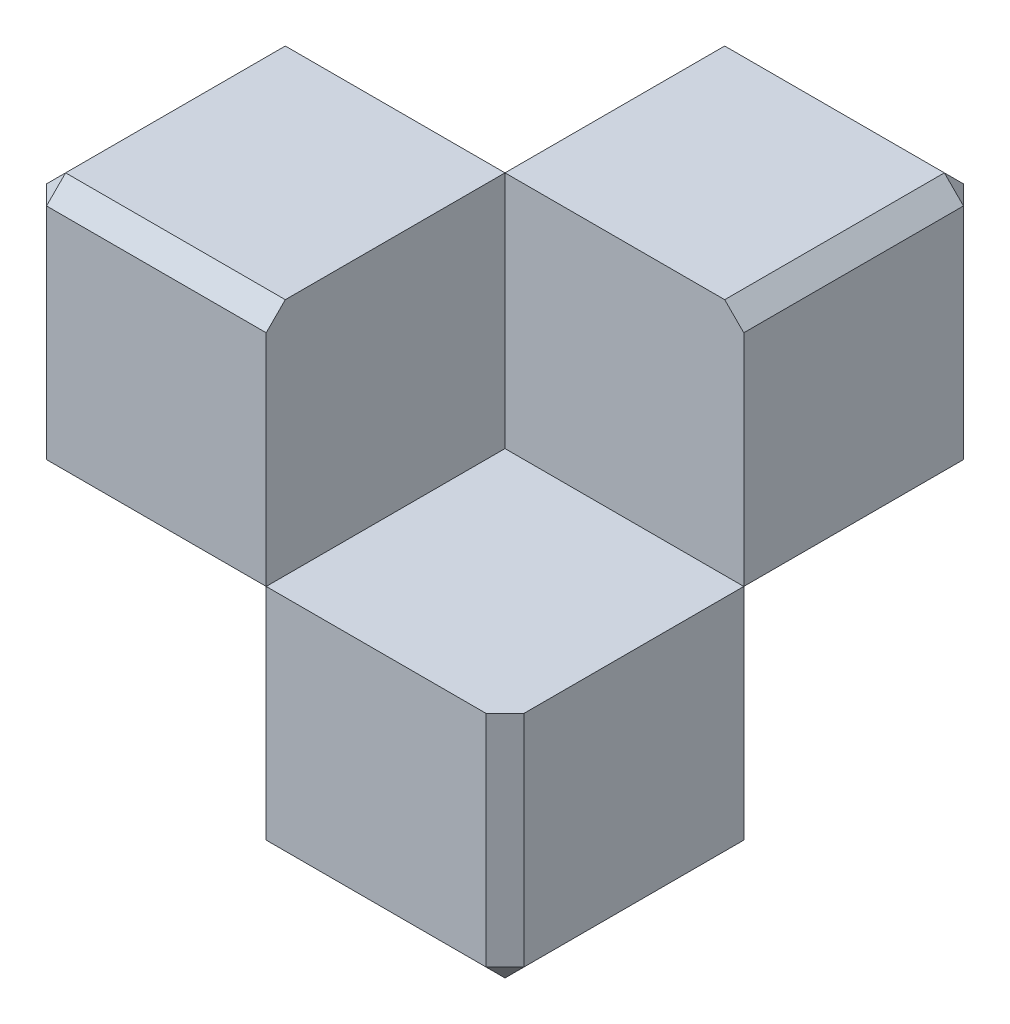
ISO-10303-21;
HEADER;
FILE_DESCRIPTION(('STEP AP214'),'2;1');
FILE_NAME('part.step','',(''),(''),'','','');
FILE_SCHEMA(('AUTOMOTIVE_DESIGN { 1 0 10303 214 1 1 1 1 }'));
ENDSEC;
DATA;
#1=APPLICATION_CONTEXT('core data for automotive mechanical design processes');
#2=APPLICATION_PROTOCOL_DEFINITION('international standard','automotive_design',2000,#1);
#3=PRODUCT_CONTEXT('',#1,'mechanical');
#4=PRODUCT('Part','Part','',(#3));
#5=PRODUCT_RELATED_PRODUCT_CATEGORY('part','',(#4));
#6=PRODUCT_DEFINITION_FORMATION('','',#4);
#7=PRODUCT_DEFINITION_CONTEXT('part definition',#1,'design');
#8=PRODUCT_DEFINITION('design','',#6,#7);
#9=PRODUCT_DEFINITION_SHAPE('','',#8);
#10=(LENGTH_UNIT() NAMED_UNIT(*) SI_UNIT(.MILLI.,.METRE.));
#11=(NAMED_UNIT(*) PLANE_ANGLE_UNIT() SI_UNIT($,.RADIAN.));
#12=(NAMED_UNIT(*) SI_UNIT($,.STERADIAN.) SOLID_ANGLE_UNIT());
#13=UNCERTAINTY_MEASURE_WITH_UNIT(LENGTH_MEASURE(1.E-05),#10,'distance_accuracy_value','');
#14=(GEOMETRIC_REPRESENTATION_CONTEXT(3) GLOBAL_UNCERTAINTY_ASSIGNED_CONTEXT((#13)) GLOBAL_UNIT_ASSIGNED_CONTEXT((#10,
#11,#12)) REPRESENTATION_CONTEXT('',''));
#15=CARTESIAN_POINT('',(0.,0.,0.));
#16=DIRECTION('',(0.,0.,1.));
#17=DIRECTION('',(1.,0.,0.));
#18=AXIS2_PLACEMENT_3D('',#15,#16,#17);
#19=CARTESIAN_POINT('',(25.,0.,50.));
#20=DIRECTION('',(1.,0.,0.));
#21=DIRECTION('',(0.,0.,-1.));
#22=AXIS2_PLACEMENT_3D('',#19,#20,#21);
#23=PLANE('',#22);
#24=DIRECTION('',(0.,0.,-1.));
#25=VECTOR('',#24,1.);
#26=CARTESIAN_POINT('',(25.,0.,50.));
#27=LINE('',#26,#25);
#28=CARTESIAN_POINT('',(25.,0.,48.));
#29=VERTEX_POINT('',#28);
#30=CARTESIAN_POINT('',(25.,0.,25.));
#31=VERTEX_POINT('',#30);
#32=EDGE_CURVE('E121',#29,#31,#27,.T.);
#33=ORIENTED_EDGE('',*,*,#32,.F.);
#34=DIRECTION('',(0.,-1.,0.));
#35=VECTOR('',#34,1.);
#36=CARTESIAN_POINT('',(25.,0.,48.));
#37=LINE('',#36,#35);
#38=CARTESIAN_POINT('',(25.,-23.,48.));
#39=VERTEX_POINT('',#38);
#40=EDGE_CURVE('E140',#29,#39,#37,.T.);
#41=ORIENTED_EDGE('',*,*,#40,.T.);
#42=DIRECTION('',(0.,0.,-1.));
#43=VECTOR('',#42,1.);
#44=CARTESIAN_POINT('',(25.,-23.,25.));
#45=LINE('',#44,#43);
#46=CARTESIAN_POINT('',(25.,-23.,25.));
#47=VERTEX_POINT('',#46);
#48=EDGE_CURVE('E138',#39,#47,#45,.T.);
#49=ORIENTED_EDGE('',*,*,#48,.T.);
#50=DIRECTION('',(0.,-1.,0.));
#51=VECTOR('',#50,1.);
#52=CARTESIAN_POINT('',(25.,0.,25.));
#53=LINE('',#52,#51);
#54=EDGE_CURVE('E131',#31,#47,#53,.T.);
#55=ORIENTED_EDGE('',*,*,#54,.F.);
#56=EDGE_LOOP('',(#33,#41,#49,#55));
#57=FACE_BOUND('',#56,.T.);
#58=ADVANCED_FACE('F46',(#57),#23,.T.);
#59=CARTESIAN_POINT('',(0.,0.,50.));
#60=DIRECTION('',(0.,1.,0.));
#61=DIRECTION('',(0.,0.,1.));
#62=AXIS2_PLACEMENT_3D('',#59,#60,#61);
#63=PLANE('',#62);
#64=DIRECTION('',(1.,0.,0.));
#65=VECTOR('',#64,1.);
#66=CARTESIAN_POINT('',(0.,0.,50.));
#67=LINE('',#66,#65);
#68=CARTESIAN_POINT('',(0.,0.,50.));
#69=VERTEX_POINT('',#68);
#70=CARTESIAN_POINT('',(23.,0.,50.));
#71=VERTEX_POINT('',#70);
#72=EDGE_CURVE('E112',#69,#71,#67,.T.);
#73=ORIENTED_EDGE('',*,*,#72,.T.);
#74=DIRECTION('',(-0.707106781186548,0.,0.707106781186547));
#75=VECTOR('',#74,1.);
#76=CARTESIAN_POINT('',(11.5,0.,61.5));
#77=LINE('',#76,#75);
#78=EDGE_CURVE('E146',#71,#29,#77,.F.);
#79=ORIENTED_EDGE('',*,*,#78,.T.);
#80=ORIENTED_EDGE('',*,*,#32,.T.);
#81=DIRECTION('',(1.,0.,0.));
#82=VECTOR('',#81,1.);
#83=CARTESIAN_POINT('',(0.,0.,25.));
#84=LINE('',#83,#82);
#85=CARTESIAN_POINT('',(0.,0.,25.));
#86=VERTEX_POINT('',#85);
#87=EDGE_CURVE('E119',#86,#31,#84,.T.);
#88=ORIENTED_EDGE('',*,*,#87,.F.);
#89=DIRECTION('',(0.,0.,-1.));
#90=VECTOR('',#89,1.);
#91=CARTESIAN_POINT('',(0.,0.,50.));
#92=LINE('',#91,#90);
#93=EDGE_CURVE('E105',#69,#86,#92,.T.);
#94=ORIENTED_EDGE('',*,*,#93,.F.);
#95=EDGE_LOOP('',(#73,#79,#80,#88,#94));
#96=FACE_BOUND('',#95,.T.);
#97=ADVANCED_FACE('F116',(#96),#63,.T.);
#98=CARTESIAN_POINT('',(0.,0.,50.));
#99=DIRECTION('',(-1.,0.,0.));
#100=DIRECTION('',(0.,-1.,0.));
#101=AXIS2_PLACEMENT_3D('',#98,#99,#100);
#102=PLANE('',#101);
#103=DIRECTION('',(0.,0.,-1.));
#104=VECTOR('',#103,1.);
#105=CARTESIAN_POINT('',(0.,-25.,50.));
#106=LINE('',#105,#104);
#107=CARTESIAN_POINT('',(0.,-25.,48.));
#108=VERTEX_POINT('',#107);
#109=CARTESIAN_POINT('',(0.,-25.,25.));
#110=VERTEX_POINT('',#109);
#111=EDGE_CURVE('E111',#108,#110,#106,.T.);
#112=ORIENTED_EDGE('',*,*,#111,.F.);
#113=DIRECTION('',(0.,0.707106781186546,0.707106781186549));
#114=VECTOR('',#113,1.);
#115=CARTESIAN_POINT('',(0.,-11.5,61.5));
#116=LINE('',#115,#114);
#117=CARTESIAN_POINT('',(0.,-23.,50.));
#118=VERTEX_POINT('',#117);
#119=EDGE_CURVE('E55',#108,#118,#116,.T.);
#120=ORIENTED_EDGE('',*,*,#119,.T.);
#121=DIRECTION('',(0.,1.,0.));
#122=VECTOR('',#121,1.);
#123=CARTESIAN_POINT('',(0.,0.,50.));
#124=LINE('',#123,#122);
#125=EDGE_CURVE('E101',#118,#69,#124,.T.);
#126=ORIENTED_EDGE('',*,*,#125,.T.);
#127=ORIENTED_EDGE('',*,*,#93,.T.);
#128=DIRECTION('',(0.,1.,0.));
#129=VECTOR('',#128,1.);
#130=CARTESIAN_POINT('',(0.,0.,25.));
#131=LINE('',#130,#129);
#132=EDGE_CURVE('E128',#110,#86,#131,.T.);
#133=ORIENTED_EDGE('',*,*,#132,.F.);
#134=EDGE_LOOP('',(#112,#120,#126,#127,#133));
#135=FACE_BOUND('',#134,.T.);
#136=ADVANCED_FACE('F103',(#135),#102,.T.);
#137=CARTESIAN_POINT('',(0.,-25.,50.));
#138=DIRECTION('',(0.,1.,0.));
#139=DIRECTION('',(0.,0.,1.));
#140=AXIS2_PLACEMENT_3D('',#137,#138,#139);
#141=PLANE('',#140);
#142=DIRECTION('',(0.,0.,1.));
#143=VECTOR('',#142,1.);
#144=CARTESIAN_POINT('',(23.,-25.,50.));
#145=LINE('',#144,#143);
#146=CARTESIAN_POINT('',(23.,-25.,25.));
#147=VERTEX_POINT('',#146);
#148=CARTESIAN_POINT('',(23.,-25.,48.));
#149=VERTEX_POINT('',#148);
#150=EDGE_CURVE('E63',#147,#149,#145,.T.);
#151=ORIENTED_EDGE('',*,*,#150,.T.);
#152=DIRECTION('',(-1.,0.,0.));
#153=VECTOR('',#152,1.);
#154=CARTESIAN_POINT('',(0.,-25.,48.));
#155=LINE('',#154,#153);
#156=EDGE_CURVE('E67',#149,#108,#155,.T.);
#157=ORIENTED_EDGE('',*,*,#156,.T.);
#158=ORIENTED_EDGE('',*,*,#111,.T.);
#159=DIRECTION('',(1.,0.,0.));
#160=VECTOR('',#159,1.);
#161=CARTESIAN_POINT('',(0.,-25.,25.));
#162=LINE('',#161,#160);
#163=EDGE_CURVE('E126',#110,#147,#162,.T.);
#164=ORIENTED_EDGE('',*,*,#163,.T.);
#165=EDGE_LOOP('',(#151,#157,#158,#164));
#166=FACE_BOUND('',#165,.T.);
#167=ADVANCED_FACE('F219',(#166),#141,.F.);
#168=CARTESIAN_POINT('',(0.,0.,50.));
#169=DIRECTION('',(0.,0.,1.));
#170=DIRECTION('',(1.,0.,0.));
#171=AXIS2_PLACEMENT_3D('',#168,#169,#170);
#172=PLANE('',#171);
#173=DIRECTION('',(1.,0.,0.));
#174=VECTOR('',#173,1.);
#175=CARTESIAN_POINT('',(25.,-23.,50.));
#176=LINE('',#175,#174);
#177=CARTESIAN_POINT('',(23.,-23.,50.));
#178=VERTEX_POINT('',#177);
#179=EDGE_CURVE('E143',#118,#178,#176,.T.);
#180=ORIENTED_EDGE('',*,*,#179,.T.);
#181=DIRECTION('',(0.,1.,0.));
#182=VECTOR('',#181,1.);
#183=CARTESIAN_POINT('',(23.,0.,50.));
#184=LINE('',#183,#182);
#185=EDGE_CURVE('E125',#178,#71,#184,.T.);
#186=ORIENTED_EDGE('',*,*,#185,.T.);
#187=ORIENTED_EDGE('',*,*,#72,.F.);
#188=ORIENTED_EDGE('',*,*,#125,.F.);
#189=EDGE_LOOP('',(#180,#186,#187,#188));
#190=FACE_BOUND('',#189,.T.);
#191=ADVANCED_FACE('F123',(#190),#172,.T.);
#192=CARTESIAN_POINT('',(0.,0.,25.));
#193=DIRECTION('',(0.,0.,1.));
#194=DIRECTION('',(1.,0.,0.));
#195=AXIS2_PLACEMENT_3D('',#192,#193,#194);
#196=PLANE('',#195);
#197=ORIENTED_EDGE('',*,*,#54,.T.);
#198=DIRECTION('',(-0.707106781186548,-0.707106781186547,0.));
#199=VECTOR('',#198,1.);
#200=CARTESIAN_POINT('',(25.,-23.,25.));
#201=LINE('',#200,#199);
#202=EDGE_CURVE('E12',#47,#147,#201,.T.);
#203=ORIENTED_EDGE('',*,*,#202,.T.);
#204=ORIENTED_EDGE('',*,*,#163,.F.);
#205=ORIENTED_EDGE('',*,*,#132,.T.);
#206=ORIENTED_EDGE('',*,*,#87,.T.);
#207=EDGE_LOOP('',(#197,#203,#204,#205,#206));
#208=FACE_BOUND('',#207,.T.);
#209=ADVANCED_FACE('F170',(#208),#196,.F.);
#210=CARTESIAN_POINT('',(25.,-23.,50.));
#211=DIRECTION('',(0.707106781186547,-0.707106781186548,0.));
#212=DIRECTION('',(0.,0.,1.));
#213=AXIS2_PLACEMENT_3D('',#210,#211,#212);
#214=PLANE('',#213);
#215=ORIENTED_EDGE('',*,*,#202,.F.);
#216=ORIENTED_EDGE('',*,*,#48,.F.);
#217=DIRECTION('',(0.707106781186548,0.707106781186547,0.));
#218=VECTOR('',#217,1.);
#219=CARTESIAN_POINT('',(25.,-23.,48.));
#220=LINE('',#219,#218);
#221=EDGE_CURVE('E50',#149,#39,#220,.T.);
#222=ORIENTED_EDGE('',*,*,#221,.F.);
#223=ORIENTED_EDGE('',*,*,#150,.F.);
#224=EDGE_LOOP('',(#215,#216,#222,#223));
#225=FACE_BOUND('',#224,.T.);
#226=ADVANCED_FACE('F48',(#225),#214,.T.);
#227=CARTESIAN_POINT('',(0.,-23.,50.));
#228=DIRECTION('',(0.,-0.707106781186549,0.707106781186546));
#229=DIRECTION('',(-1.,0.,0.));
#230=AXIS2_PLACEMENT_3D('',#227,#228,#229);
#231=PLANE('',#230);
#232=ORIENTED_EDGE('',*,*,#119,.F.);
#233=ORIENTED_EDGE('',*,*,#156,.F.);
#234=DIRECTION('',(0.,-0.707106781186546,-0.707106781186549));
#235=VECTOR('',#234,1.);
#236=CARTESIAN_POINT('',(23.,-24.,49.));
#237=LINE('',#236,#235);
#238=EDGE_CURVE('E152',#178,#149,#237,.T.);
#239=ORIENTED_EDGE('',*,*,#238,.F.);
#240=ORIENTED_EDGE('',*,*,#179,.F.);
#241=EDGE_LOOP('',(#232,#233,#239,#240));
#242=FACE_BOUND('',#241,.T.);
#243=ADVANCED_FACE('F173',(#242),#231,.T.);
#244=CARTESIAN_POINT('',(25.,-23.,48.));
#245=DIRECTION('',(0.577350269189624,-0.577350269189627,0.577350269189626));
#246=DIRECTION('',(0.,-0.707106781186546,-0.707106781186549));
#247=AXIS2_PLACEMENT_3D('',#244,#245,#246);
#248=PLANE('',#247);
#249=ORIENTED_EDGE('',*,*,#238,.T.);
#250=ORIENTED_EDGE('',*,*,#221,.T.);
#251=DIRECTION('',(0.707106781186548,0.,-0.707106781186547));
#252=VECTOR('',#251,1.);
#253=CARTESIAN_POINT('',(25.,-23.,48.));
#254=LINE('',#253,#252);
#255=EDGE_CURVE('E151',#178,#39,#254,.T.);
#256=ORIENTED_EDGE('',*,*,#255,.F.);
#257=EDGE_LOOP('',(#249,#250,#256));
#258=FACE_BOUND('',#257,.T.);
#259=ADVANCED_FACE('F160',(#258),#248,.T.);
#260=CARTESIAN_POINT('',(25.,0.,48.));
#261=DIRECTION('',(-0.707106781186547,0.,-0.707106781186548));
#262=DIRECTION('',(0.,-1.,0.));
#263=AXIS2_PLACEMENT_3D('',#260,#261,#262);
#264=PLANE('',#263);
#265=ORIENTED_EDGE('',*,*,#78,.F.);
#266=ORIENTED_EDGE('',*,*,#185,.F.);
#267=ORIENTED_EDGE('',*,*,#255,.T.);
#268=ORIENTED_EDGE('',*,*,#40,.F.);
#269=EDGE_LOOP('',(#265,#266,#267,#268));
#270=FACE_BOUND('',#269,.T.);
#271=ADVANCED_FACE('F168',(#270),#264,.F.);
#272=CLOSED_SHELL('',(#58,#97,#136,#167,#191,#209,#226,#243,#259,#271));
#273=MANIFOLD_SOLID_BREP('B2',#272);
#274=CARTESIAN_POINT('',(-25.,0.,50.));
#275=DIRECTION('',(-1.,0.,0.));
#276=DIRECTION('',(0.,0.,1.));
#277=AXIS2_PLACEMENT_3D('',#274,#275,#276);
#278=PLANE('',#277);
#279=DIRECTION('',(0.,0.,-1.));
#280=VECTOR('',#279,1.);
#281=CARTESIAN_POINT('',(-25.,0.,50.));
#282=LINE('',#281,#280);
#283=CARTESIAN_POINT('',(-25.,0.,48.));
#284=VERTEX_POINT('',#283);
#285=CARTESIAN_POINT('',(-25.,0.,25.));
#286=VERTEX_POINT('',#285);
#287=EDGE_CURVE('E335',#284,#286,#282,.T.);
#288=ORIENTED_EDGE('',*,*,#287,.F.);
#289=DIRECTION('',(0.,1.,0.));
#290=VECTOR('',#289,1.);
#291=CARTESIAN_POINT('',(-25.,0.,48.));
#292=LINE('',#291,#290);
#293=CARTESIAN_POINT('',(-25.,23.,48.));
#294=VERTEX_POINT('',#293);
#295=EDGE_CURVE('E362',#284,#294,#292,.T.);
#296=ORIENTED_EDGE('',*,*,#295,.T.);
#297=DIRECTION('',(0.,0.,-1.));
#298=VECTOR('',#297,1.);
#299=CARTESIAN_POINT('',(-25.,23.,25.));
#300=LINE('',#299,#298);
#301=CARTESIAN_POINT('',(-25.,23.,25.));
#302=VERTEX_POINT('',#301);
#303=EDGE_CURVE('E360',#294,#302,#300,.T.);
#304=ORIENTED_EDGE('',*,*,#303,.T.);
#305=DIRECTION('',(0.,1.,0.));
#306=VECTOR('',#305,1.);
#307=CARTESIAN_POINT('',(-25.,0.,25.));
#308=LINE('',#307,#306);
#309=EDGE_CURVE('E353',#286,#302,#308,.T.);
#310=ORIENTED_EDGE('',*,*,#309,.F.);
#311=EDGE_LOOP('',(#288,#296,#304,#310));
#312=FACE_BOUND('',#311,.T.);
#313=ADVANCED_FACE('F268',(#312),#278,.T.);
#314=CARTESIAN_POINT('',(0.,0.,50.));
#315=DIRECTION('',(0.,-1.,0.));
#316=DIRECTION('',(1.,0.,0.));
#317=AXIS2_PLACEMENT_3D('',#314,#315,#316);
#318=PLANE('',#317);
#319=DIRECTION('',(-1.,0.,0.));
#320=VECTOR('',#319,1.);
#321=CARTESIAN_POINT('',(0.,0.,50.));
#322=LINE('',#321,#320);
#323=CARTESIAN_POINT('',(0.,0.,50.));
#324=VERTEX_POINT('',#323);
#325=CARTESIAN_POINT('',(-23.,0.,50.));
#326=VERTEX_POINT('',#325);
#327=EDGE_CURVE('E328',#324,#326,#322,.T.);
#328=ORIENTED_EDGE('',*,*,#327,.T.);
#329=DIRECTION('',(0.707106781186549,0.,0.707106781186546));
#330=VECTOR('',#329,1.);
#331=CARTESIAN_POINT('',(-11.5,0.,61.5));
#332=LINE('',#331,#330);
#333=EDGE_CURVE('E368',#326,#284,#332,.F.);
#334=ORIENTED_EDGE('',*,*,#333,.T.);
#335=ORIENTED_EDGE('',*,*,#287,.T.);
#336=DIRECTION('',(-1.,0.,0.));
#337=VECTOR('',#336,1.);
#338=CARTESIAN_POINT('',(0.,0.,25.));
#339=LINE('',#338,#337);
#340=CARTESIAN_POINT('',(0.,0.,25.));
#341=VERTEX_POINT('',#340);
#342=EDGE_CURVE('E331',#341,#286,#339,.T.);
#343=ORIENTED_EDGE('',*,*,#342,.F.);
#344=DIRECTION('',(0.,0.,-1.));
#345=VECTOR('',#344,1.);
#346=CARTESIAN_POINT('',(0.,0.,50.));
#347=LINE('',#346,#345);
#348=EDGE_CURVE('E324',#324,#341,#347,.T.);
#349=ORIENTED_EDGE('',*,*,#348,.F.);
#350=EDGE_LOOP('',(#328,#334,#335,#343,#349));
#351=FACE_BOUND('',#350,.T.);
#352=ADVANCED_FACE('F326',(#351),#318,.T.);
#353=CARTESIAN_POINT('',(0.,0.,50.));
#354=DIRECTION('',(-1.,0.,0.));
#355=DIRECTION('',(0.,-1.,0.));
#356=AXIS2_PLACEMENT_3D('',#353,#354,#355);
#357=PLANE('',#356);
#358=DIRECTION('',(0.,0.,-1.));
#359=VECTOR('',#358,1.);
#360=CARTESIAN_POINT('',(0.,25.,50.));
#361=LINE('',#360,#359);
#362=CARTESIAN_POINT('',(0.,25.,48.));
#363=VERTEX_POINT('',#362);
#364=CARTESIAN_POINT('',(0.,25.,25.));
#365=VERTEX_POINT('',#364);
#366=EDGE_CURVE('E336',#363,#365,#361,.T.);
#367=ORIENTED_EDGE('',*,*,#366,.F.);
#368=DIRECTION('',(0.,-0.707106781186546,0.707106781186549));
#369=VECTOR('',#368,1.);
#370=CARTESIAN_POINT('',(0.,23.,50.));
#371=LINE('',#370,#369);
#372=CARTESIAN_POINT('',(0.,23.,50.));
#373=VERTEX_POINT('',#372);
#374=EDGE_CURVE('E277',#363,#373,#371,.T.);
#375=ORIENTED_EDGE('',*,*,#374,.T.);
#376=DIRECTION('',(0.,1.,0.));
#377=VECTOR('',#376,1.);
#378=CARTESIAN_POINT('',(0.,0.,50.));
#379=LINE('',#378,#377);
#380=EDGE_CURVE('E339',#324,#373,#379,.T.);
#381=ORIENTED_EDGE('',*,*,#380,.F.);
#382=ORIENTED_EDGE('',*,*,#348,.T.);
#383=DIRECTION('',(0.,1.,0.));
#384=VECTOR('',#383,1.);
#385=CARTESIAN_POINT('',(0.,0.,25.));
#386=LINE('',#385,#384);
#387=EDGE_CURVE('E350',#341,#365,#386,.T.);
#388=ORIENTED_EDGE('',*,*,#387,.T.);
#389=EDGE_LOOP('',(#367,#375,#381,#382,#388));
#390=FACE_BOUND('',#389,.T.);
#391=ADVANCED_FACE('F340',(#390),#357,.F.);
#392=CARTESIAN_POINT('',(0.,25.,50.));
#393=DIRECTION('',(0.,-1.,0.));
#394=DIRECTION('',(1.,0.,0.));
#395=AXIS2_PLACEMENT_3D('',#392,#393,#394);
#396=PLANE('',#395);
#397=DIRECTION('',(0.,0.,1.));
#398=VECTOR('',#397,1.);
#399=CARTESIAN_POINT('',(-23.,25.,50.));
#400=LINE('',#399,#398);
#401=CARTESIAN_POINT('',(-23.,25.,25.));
#402=VERTEX_POINT('',#401);
#403=CARTESIAN_POINT('',(-23.,25.,48.));
#404=VERTEX_POINT('',#403);
#405=EDGE_CURVE('E285',#402,#404,#400,.T.);
#406=ORIENTED_EDGE('',*,*,#405,.T.);
#407=DIRECTION('',(1.,0.,0.));
#408=VECTOR('',#407,1.);
#409=CARTESIAN_POINT('',(0.,25.,48.));
#410=LINE('',#409,#408);
#411=EDGE_CURVE('E289',#404,#363,#410,.T.);
#412=ORIENTED_EDGE('',*,*,#411,.T.);
#413=ORIENTED_EDGE('',*,*,#366,.T.);
#414=DIRECTION('',(-1.,0.,0.));
#415=VECTOR('',#414,1.);
#416=CARTESIAN_POINT('',(0.,25.,25.));
#417=LINE('',#416,#415);
#418=EDGE_CURVE('E348',#365,#402,#417,.T.);
#419=ORIENTED_EDGE('',*,*,#418,.T.);
#420=EDGE_LOOP('',(#406,#412,#413,#419));
#421=FACE_BOUND('',#420,.T.);
#422=ADVANCED_FACE('F441',(#421),#396,.F.);
#423=CARTESIAN_POINT('',(0.,0.,50.));
#424=DIRECTION('',(0.,0.,1.));
#425=DIRECTION('',(1.,0.,0.));
#426=AXIS2_PLACEMENT_3D('',#423,#424,#425);
#427=PLANE('',#426);
#428=DIRECTION('',(-1.,0.,0.));
#429=VECTOR('',#428,1.);
#430=CARTESIAN_POINT('',(-25.,23.,50.));
#431=LINE('',#430,#429);
#432=CARTESIAN_POINT('',(-23.,23.,50.));
#433=VERTEX_POINT('',#432);
#434=EDGE_CURVE('E365',#373,#433,#431,.T.);
#435=ORIENTED_EDGE('',*,*,#434,.T.);
#436=DIRECTION('',(0.,-1.,0.));
#437=VECTOR('',#436,1.);
#438=CARTESIAN_POINT('',(-23.,0.,50.));
#439=LINE('',#438,#437);
#440=EDGE_CURVE('E347',#433,#326,#439,.T.);
#441=ORIENTED_EDGE('',*,*,#440,.T.);
#442=ORIENTED_EDGE('',*,*,#327,.F.);
#443=ORIENTED_EDGE('',*,*,#380,.T.);
#444=EDGE_LOOP('',(#435,#441,#442,#443));
#445=FACE_BOUND('',#444,.T.);
#446=ADVANCED_FACE('F345',(#445),#427,.T.);
#447=CARTESIAN_POINT('',(0.,0.,25.));
#448=DIRECTION('',(0.,0.,1.));
#449=DIRECTION('',(1.,0.,0.));
#450=AXIS2_PLACEMENT_3D('',#447,#448,#449);
#451=PLANE('',#450);
#452=ORIENTED_EDGE('',*,*,#309,.T.);
#453=DIRECTION('',(0.707106781186549,0.707106781186546,0.));
#454=VECTOR('',#453,1.);
#455=CARTESIAN_POINT('',(-25.,23.,25.));
#456=LINE('',#455,#454);
#457=EDGE_CURVE('E44',#302,#402,#456,.T.);
#458=ORIENTED_EDGE('',*,*,#457,.T.);
#459=ORIENTED_EDGE('',*,*,#418,.F.);
#460=ORIENTED_EDGE('',*,*,#387,.F.);
#461=ORIENTED_EDGE('',*,*,#342,.T.);
#462=EDGE_LOOP('',(#452,#458,#459,#460,#461));
#463=FACE_BOUND('',#462,.T.);
#464=ADVANCED_FACE('F392',(#463),#451,.F.);
#465=CARTESIAN_POINT('',(-25.,23.,50.));
#466=DIRECTION('',(-0.707106781186546,0.707106781186549,0.));
#467=DIRECTION('',(0.,0.,1.));
#468=AXIS2_PLACEMENT_3D('',#465,#466,#467);
#469=PLANE('',#468);
#470=ORIENTED_EDGE('',*,*,#457,.F.);
#471=ORIENTED_EDGE('',*,*,#303,.F.);
#472=DIRECTION('',(-0.707106781186549,-0.707106781186546,0.));
#473=VECTOR('',#472,1.);
#474=CARTESIAN_POINT('',(-25.,23.,48.));
#475=LINE('',#474,#473);
#476=EDGE_CURVE('E272',#404,#294,#475,.T.);
#477=ORIENTED_EDGE('',*,*,#476,.F.);
#478=ORIENTED_EDGE('',*,*,#405,.F.);
#479=EDGE_LOOP('',(#470,#471,#477,#478));
#480=FACE_BOUND('',#479,.T.);
#481=ADVANCED_FACE('F270',(#480),#469,.T.);
#482=CARTESIAN_POINT('',(0.,23.,50.));
#483=DIRECTION('',(0.,0.707106781186549,0.707106781186546));
#484=DIRECTION('',(1.,0.,0.));
#485=AXIS2_PLACEMENT_3D('',#482,#483,#484);
#486=PLANE('',#485);
#487=ORIENTED_EDGE('',*,*,#374,.F.);
#488=ORIENTED_EDGE('',*,*,#411,.F.);
#489=DIRECTION('',(0.,0.707106781186546,-0.707106781186549));
#490=VECTOR('',#489,1.);
#491=CARTESIAN_POINT('',(-23.,24.,49.));
#492=LINE('',#491,#490);
#493=EDGE_CURVE('E374',#433,#404,#492,.T.);
#494=ORIENTED_EDGE('',*,*,#493,.F.);
#495=ORIENTED_EDGE('',*,*,#434,.F.);
#496=EDGE_LOOP('',(#487,#488,#494,#495));
#497=FACE_BOUND('',#496,.T.);
#498=ADVANCED_FACE('F395',(#497),#486,.T.);
#499=CARTESIAN_POINT('',(-25.,23.,48.));
#500=DIRECTION('',(-0.577350269189624,0.577350269189628,0.577350269189626));
#501=DIRECTION('',(0.,-0.707106781186546,0.707106781186549));
#502=AXIS2_PLACEMENT_3D('',#499,#500,#501);
#503=PLANE('',#502);
#504=ORIENTED_EDGE('',*,*,#493,.T.);
#505=ORIENTED_EDGE('',*,*,#476,.T.);
#506=DIRECTION('',(-0.707106781186549,0.,-0.707106781186546));
#507=VECTOR('',#506,1.);
#508=CARTESIAN_POINT('',(-25.,23.,48.));
#509=LINE('',#508,#507);
#510=EDGE_CURVE('E373',#433,#294,#509,.T.);
#511=ORIENTED_EDGE('',*,*,#510,.F.);
#512=EDGE_LOOP('',(#504,#505,#511));
#513=FACE_BOUND('',#512,.T.);
#514=ADVANCED_FACE('F382',(#513),#503,.T.);
#515=CARTESIAN_POINT('',(-25.,0.,48.));
#516=DIRECTION('',(0.707106781186546,0.,-0.707106781186549));
#517=DIRECTION('',(0.,1.,0.));
#518=AXIS2_PLACEMENT_3D('',#515,#516,#517);
#519=PLANE('',#518);
#520=ORIENTED_EDGE('',*,*,#333,.F.);
#521=ORIENTED_EDGE('',*,*,#440,.F.);
#522=ORIENTED_EDGE('',*,*,#510,.T.);
#523=ORIENTED_EDGE('',*,*,#295,.F.);
#524=EDGE_LOOP('',(#520,#521,#522,#523));
#525=FACE_BOUND('',#524,.T.);
#526=ADVANCED_FACE('F390',(#525),#519,.F.);
#527=CLOSED_SHELL('',(#313,#352,#391,#422,#446,#464,#481,#498,#514,#526));
#528=MANIFOLD_SOLID_BREP('B6',#527);
#529=CARTESIAN_POINT('',(0.,0.,25.));
#530=DIRECTION('',(0.,1.,0.));
#531=DIRECTION('',(0.,0.,1.));
#532=AXIS2_PLACEMENT_3D('',#529,#530,#531);
#533=PLANE('',#532);
#534=DIRECTION('',(1.,0.,0.));
#535=VECTOR('',#534,1.);
#536=CARTESIAN_POINT('',(0.,0.,0.));
#537=LINE('',#536,#535);
#538=CARTESIAN_POINT('',(0.,0.,0.));
#539=VERTEX_POINT('',#538);
#540=CARTESIAN_POINT('',(23.,0.,0.));
#541=VERTEX_POINT('',#540);
#542=EDGE_CURVE('E591',#539,#541,#537,.T.);
#543=ORIENTED_EDGE('',*,*,#542,.T.);
#544=DIRECTION('',(-0.707106781186547,0.,-0.707106781186548));
#545=VECTOR('',#544,1.);
#546=CARTESIAN_POINT('',(25.,0.,2.00000000000001));
#547=LINE('',#546,#545);
#548=CARTESIAN_POINT('',(25.,0.,2.00000000000001));
#549=VERTEX_POINT('',#548);
#550=EDGE_CURVE('E498',#541,#549,#547,.F.);
#551=ORIENTED_EDGE('',*,*,#550,.T.);
#552=DIRECTION('',(0.,0.,-1.));
#553=VECTOR('',#552,1.);
#554=CARTESIAN_POINT('',(25.,0.,25.));
#555=LINE('',#554,#553);
#556=CARTESIAN_POINT('',(25.,0.,25.));
#557=VERTEX_POINT('',#556);
#558=EDGE_CURVE('E548',#557,#549,#555,.T.);
#559=ORIENTED_EDGE('',*,*,#558,.F.);
#560=DIRECTION('',(1.,0.,0.));
#561=VECTOR('',#560,1.);
#562=CARTESIAN_POINT('',(0.,0.,25.));
#563=LINE('',#562,#561);
#564=CARTESIAN_POINT('',(0.,0.,25.));
#565=VERTEX_POINT('',#564);
#566=EDGE_CURVE('E553',#565,#557,#563,.T.);
#567=ORIENTED_EDGE('',*,*,#566,.F.);
#568=DIRECTION('',(0.,0.,-1.));
#569=VECTOR('',#568,1.);
#570=CARTESIAN_POINT('',(0.,0.,25.));
#571=LINE('',#570,#569);
#572=EDGE_CURVE('E569',#565,#539,#571,.T.);
#573=ORIENTED_EDGE('',*,*,#572,.T.);
#574=EDGE_LOOP('',(#543,#551,#559,#567,#573));
#575=FACE_BOUND('',#574,.T.);
#576=ADVANCED_FACE('F489',(#575),#533,.F.);
#577=CARTESIAN_POINT('',(25.,0.,25.));
#578=DIRECTION('',(-1.,0.,0.));
#579=DIRECTION('',(0.,0.,1.));
#580=AXIS2_PLACEMENT_3D('',#577,#578,#579);
#581=PLANE('',#580);
#582=ORIENTED_EDGE('',*,*,#558,.T.);
#583=DIRECTION('',(0.,1.,0.));
#584=VECTOR('',#583,1.);
#585=CARTESIAN_POINT('',(25.,0.,2.00000000000001));
#586=LINE('',#585,#584);
#587=CARTESIAN_POINT('',(25.,23.,2.00000000000001));
#588=VERTEX_POINT('',#587);
#589=EDGE_CURVE('E506',#549,#588,#586,.T.);
#590=ORIENTED_EDGE('',*,*,#589,.T.);
#591=DIRECTION('',(0.,0.,1.));
#592=VECTOR('',#591,1.);
#593=CARTESIAN_POINT('',(25.,23.,25.));
#594=LINE('',#593,#592);
#595=CARTESIAN_POINT('',(25.,23.,25.));
#596=VERTEX_POINT('',#595);
#597=EDGE_CURVE('E549',#588,#596,#594,.T.);
#598=ORIENTED_EDGE('',*,*,#597,.T.);
#599=DIRECTION('',(0.,1.,0.));
#600=VECTOR('',#599,1.);
#601=CARTESIAN_POINT('',(25.,0.,25.));
#602=LINE('',#601,#600);
#603=EDGE_CURVE('E545',#557,#596,#602,.T.);
#604=ORIENTED_EDGE('',*,*,#603,.F.);
#605=EDGE_LOOP('',(#582,#590,#598,#604));
#606=FACE_BOUND('',#605,.T.);
#607=ADVANCED_FACE('F547',(#606),#581,.F.);
#608=CARTESIAN_POINT('',(0.,25.,25.));
#609=DIRECTION('',(0.,1.,0.));
#610=DIRECTION('',(0.,0.,1.));
#611=AXIS2_PLACEMENT_3D('',#608,#609,#610);
#612=PLANE('',#611);
#613=DIRECTION('',(0.,0.,-1.));
#614=VECTOR('',#613,1.);
#615=CARTESIAN_POINT('',(23.,25.,0.));
#616=LINE('',#615,#614);
#617=CARTESIAN_POINT('',(23.,25.,25.));
#618=VERTEX_POINT('',#617);
#619=CARTESIAN_POINT('',(23.,25.,2.00000000000001));
#620=VERTEX_POINT('',#619);
#621=EDGE_CURVE('E575',#618,#620,#616,.T.);
#622=ORIENTED_EDGE('',*,*,#621,.T.);
#623=DIRECTION('',(-1.,0.,0.));
#624=VECTOR('',#623,1.);
#625=CARTESIAN_POINT('',(0.,25.,2.00000000000001));
#626=LINE('',#625,#624);
#627=CARTESIAN_POINT('',(0.,25.,2.00000000000002));
#628=VERTEX_POINT('',#627);
#629=EDGE_CURVE('E577',#620,#628,#626,.T.);
#630=ORIENTED_EDGE('',*,*,#629,.T.);
#631=DIRECTION('',(0.,0.,-1.));
#632=VECTOR('',#631,1.);
#633=CARTESIAN_POINT('',(0.,25.,25.));
#634=LINE('',#633,#632);
#635=CARTESIAN_POINT('',(0.,25.,25.));
#636=VERTEX_POINT('',#635);
#637=EDGE_CURVE('E564',#636,#628,#634,.T.);
#638=ORIENTED_EDGE('',*,*,#637,.F.);
#639=DIRECTION('',(1.,0.,0.));
#640=VECTOR('',#639,1.);
#641=CARTESIAN_POINT('',(0.,25.,25.));
#642=LINE('',#641,#640);
#643=EDGE_CURVE('E552',#636,#618,#642,.T.);
#644=ORIENTED_EDGE('',*,*,#643,.T.);
#645=EDGE_LOOP('',(#622,#630,#638,#644));
#646=FACE_BOUND('',#645,.T.);
#647=ADVANCED_FACE('F604',(#646),#612,.T.);
#648=CARTESIAN_POINT('',(0.,0.,25.));
#649=DIRECTION('',(-1.,0.,0.));
#650=DIRECTION('',(0.,0.,1.));
#651=AXIS2_PLACEMENT_3D('',#648,#649,#650);
#652=PLANE('',#651);
#653=ORIENTED_EDGE('',*,*,#637,.T.);
#654=DIRECTION('',(0.,-0.707106781186548,-0.707106781186547));
#655=VECTOR('',#654,1.);
#656=CARTESIAN_POINT('',(0.,24.,0.999999999999987));
#657=LINE('',#656,#655);
#658=CARTESIAN_POINT('',(0.,23.,0.));
#659=VERTEX_POINT('',#658);
#660=EDGE_CURVE('E579',#628,#659,#657,.T.);
#661=ORIENTED_EDGE('',*,*,#660,.T.);
#662=DIRECTION('',(0.,1.,0.));
#663=VECTOR('',#662,1.);
#664=CARTESIAN_POINT('',(0.,0.,0.));
#665=LINE('',#664,#663);
#666=EDGE_CURVE('E561',#539,#659,#665,.T.);
#667=ORIENTED_EDGE('',*,*,#666,.F.);
#668=ORIENTED_EDGE('',*,*,#572,.F.);
#669=DIRECTION('',(0.,1.,0.));
#670=VECTOR('',#669,1.);
#671=CARTESIAN_POINT('',(0.,0.,25.));
#672=LINE('',#671,#670);
#673=EDGE_CURVE('E560',#565,#636,#672,.T.);
#674=ORIENTED_EDGE('',*,*,#673,.T.);
#675=EDGE_LOOP('',(#653,#661,#667,#668,#674));
#676=FACE_BOUND('',#675,.T.);
#677=ADVANCED_FACE('F629',(#676),#652,.T.);
#678=CARTESIAN_POINT('',(0.,0.,25.));
#679=DIRECTION('',(0.,0.,1.));
#680=DIRECTION('',(1.,0.,0.));
#681=AXIS2_PLACEMENT_3D('',#678,#679,#680);
#682=PLANE('',#681);
#683=ORIENTED_EDGE('',*,*,#603,.T.);
#684=DIRECTION('',(-0.707106781186547,0.707106781186548,0.));
#685=VECTOR('',#684,1.);
#686=CARTESIAN_POINT('',(24.,24.,25.));
#687=LINE('',#686,#685);
#688=EDGE_CURVE('E266',#596,#618,#687,.T.);
#689=ORIENTED_EDGE('',*,*,#688,.T.);
#690=ORIENTED_EDGE('',*,*,#643,.F.);
#691=ORIENTED_EDGE('',*,*,#673,.F.);
#692=ORIENTED_EDGE('',*,*,#566,.T.);
#693=EDGE_LOOP('',(#683,#689,#690,#691,#692));
#694=FACE_BOUND('',#693,.T.);
#695=ADVANCED_FACE('F557',(#694),#682,.T.);
#696=CARTESIAN_POINT('',(0.,0.,0.));
#697=DIRECTION('',(0.,0.,1.));
#698=DIRECTION('',(1.,0.,0.));
#699=AXIS2_PLACEMENT_3D('',#696,#697,#698);
#700=PLANE('',#699);
#701=ORIENTED_EDGE('',*,*,#666,.T.);
#702=DIRECTION('',(1.,0.,0.));
#703=VECTOR('',#702,1.);
#704=CARTESIAN_POINT('',(25.,23.,0.));
#705=LINE('',#704,#703);
#706=CARTESIAN_POINT('',(23.,23.,0.));
#707=VERTEX_POINT('',#706);
#708=EDGE_CURVE('E566',#659,#707,#705,.T.);
#709=ORIENTED_EDGE('',*,*,#708,.T.);
#710=DIRECTION('',(0.,-1.,0.));
#711=VECTOR('',#710,1.);
#712=CARTESIAN_POINT('',(23.,0.,0.));
#713=LINE('',#712,#711);
#714=EDGE_CURVE('E563',#707,#541,#713,.T.);
#715=ORIENTED_EDGE('',*,*,#714,.T.);
#716=ORIENTED_EDGE('',*,*,#542,.F.);
#717=EDGE_LOOP('',(#701,#709,#715,#716));
#718=FACE_BOUND('',#717,.T.);
#719=ADVANCED_FACE('F632',(#718),#700,.F.);
#720=CARTESIAN_POINT('',(25.,0.,2.00000000000001));
#721=DIRECTION('',(-0.707106781186548,0.,0.707106781186547));
#722=DIRECTION('',(0.,1.,0.));
#723=AXIS2_PLACEMENT_3D('',#720,#721,#722);
#724=PLANE('',#723);
#725=ORIENTED_EDGE('',*,*,#550,.F.);
#726=ORIENTED_EDGE('',*,*,#714,.F.);
#727=DIRECTION('',(0.707106781186547,0.,0.707106781186548));
#728=VECTOR('',#727,1.);
#729=CARTESIAN_POINT('',(23.,23.,0.));
#730=LINE('',#729,#728);
#731=EDGE_CURVE('E493',#588,#707,#730,.F.);
#732=ORIENTED_EDGE('',*,*,#731,.F.);
#733=ORIENTED_EDGE('',*,*,#589,.F.);
#734=EDGE_LOOP('',(#725,#726,#732,#733));
#735=FACE_BOUND('',#734,.T.);
#736=ADVANCED_FACE('F491',(#735),#724,.F.);
#737=CARTESIAN_POINT('',(23.,25.,25.));
#738=DIRECTION('',(0.707106781186548,0.707106781186547,0.));
#739=DIRECTION('',(0.,0.,1.));
#740=AXIS2_PLACEMENT_3D('',#737,#738,#739);
#741=PLANE('',#740);
#742=ORIENTED_EDGE('',*,*,#688,.F.);
#743=ORIENTED_EDGE('',*,*,#597,.F.);
#744=DIRECTION('',(0.707106781186547,-0.707106781186548,0.));
#745=VECTOR('',#744,1.);
#746=CARTESIAN_POINT('',(24.,24.,2.00000000000001));
#747=LINE('',#746,#745);
#748=EDGE_CURVE('E585',#620,#588,#747,.T.);
#749=ORIENTED_EDGE('',*,*,#748,.F.);
#750=ORIENTED_EDGE('',*,*,#621,.F.);
#751=EDGE_LOOP('',(#742,#743,#749,#750));
#752=FACE_BOUND('',#751,.T.);
#753=ADVANCED_FACE('F606',(#752),#741,.T.);
#754=CARTESIAN_POINT('',(23.,23.,0.));
#755=DIRECTION('',(0.577350269189627,0.577350269189625,-0.577350269189626));
#756=DIRECTION('',(-0.707106781186547,0.,-0.707106781186548));
#757=AXIS2_PLACEMENT_3D('',#754,#755,#756);
#758=PLANE('',#757);
#759=ORIENTED_EDGE('',*,*,#748,.T.);
#760=ORIENTED_EDGE('',*,*,#731,.T.);
#761=DIRECTION('',(0.,0.707106781186548,0.707106781186547));
#762=VECTOR('',#761,1.);
#763=CARTESIAN_POINT('',(23.,23.,0.));
#764=LINE('',#763,#762);
#765=EDGE_CURVE('E584',#620,#707,#764,.F.);
#766=ORIENTED_EDGE('',*,*,#765,.F.);
#767=EDGE_LOOP('',(#759,#760,#766));
#768=FACE_BOUND('',#767,.T.);
#769=ADVANCED_FACE('F612',(#768),#758,.T.);
#770=CARTESIAN_POINT('',(0.,23.,0.));
#771=DIRECTION('',(0.,0.707106781186547,-0.707106781186548));
#772=DIRECTION('',(-1.,0.,0.));
#773=AXIS2_PLACEMENT_3D('',#770,#771,#772);
#774=PLANE('',#773);
#775=ORIENTED_EDGE('',*,*,#660,.F.);
#776=ORIENTED_EDGE('',*,*,#629,.F.);
#777=ORIENTED_EDGE('',*,*,#765,.T.);
#778=ORIENTED_EDGE('',*,*,#708,.F.);
#779=EDGE_LOOP('',(#775,#776,#777,#778));
#780=FACE_BOUND('',#779,.T.);
#781=ADVANCED_FACE('F610',(#780),#774,.T.);
#782=CLOSED_SHELL('',(#576,#607,#647,#677,#695,#719,#736,#753,#769,#781));
#783=MANIFOLD_SOLID_BREP('B38',#782);
#784=CARTESIAN_POINT('',(0.,0.,25.));
#785=DIRECTION('',(0.,-1.,0.));
#786=DIRECTION('',(1.,0.,0.));
#787=AXIS2_PLACEMENT_3D('',#784,#785,#786);
#788=PLANE('',#787);
#789=DIRECTION('',(-1.,0.,0.));
#790=VECTOR('',#789,1.);
#791=CARTESIAN_POINT('',(0.,0.,0.));
#792=LINE('',#791,#790);
#793=CARTESIAN_POINT('',(0.,0.,0.));
#794=VERTEX_POINT('',#793);
#795=CARTESIAN_POINT('',(-23.,0.,0.));
#796=VERTEX_POINT('',#795);
#797=EDGE_CURVE('E807',#794,#796,#792,.T.);
#798=ORIENTED_EDGE('',*,*,#797,.T.);
#799=DIRECTION('',(0.707106781186548,0.,-0.707106781186547));
#800=VECTOR('',#799,1.);
#801=CARTESIAN_POINT('',(-25.,0.,2.00000000000001));
#802=LINE('',#801,#800);
#803=CARTESIAN_POINT('',(-25.,0.,2.00000000000001));
#804=VERTEX_POINT('',#803);
#805=EDGE_CURVE('E487',#796,#804,#802,.F.);
#806=ORIENTED_EDGE('',*,*,#805,.T.);
#807=DIRECTION('',(0.,0.,-1.));
#808=VECTOR('',#807,1.);
#809=CARTESIAN_POINT('',(-25.,0.,25.));
#810=LINE('',#809,#808);
#811=CARTESIAN_POINT('',(-25.,0.,25.));
#812=VERTEX_POINT('',#811);
#813=EDGE_CURVE('E760',#812,#804,#810,.T.);
#814=ORIENTED_EDGE('',*,*,#813,.F.);
#815=DIRECTION('',(-1.,0.,0.));
#816=VECTOR('',#815,1.);
#817=CARTESIAN_POINT('',(0.,0.,25.));
#818=LINE('',#817,#816);
#819=CARTESIAN_POINT('',(0.,0.,25.));
#820=VERTEX_POINT('',#819);
#821=EDGE_CURVE('E767',#820,#812,#818,.T.);
#822=ORIENTED_EDGE('',*,*,#821,.F.);
#823=DIRECTION('',(0.,0.,-1.));
#824=VECTOR('',#823,1.);
#825=CARTESIAN_POINT('',(0.,0.,25.));
#826=LINE('',#825,#824);
#827=EDGE_CURVE('E785',#820,#794,#826,.T.);
#828=ORIENTED_EDGE('',*,*,#827,.T.);
#829=EDGE_LOOP('',(#798,#806,#814,#822,#828));
#830=FACE_BOUND('',#829,.T.);
#831=ADVANCED_FACE('F698',(#830),#788,.F.);
#832=CARTESIAN_POINT('',(-25.,0.,25.));
#833=DIRECTION('',(1.,0.,0.));
#834=DIRECTION('',(0.,0.,-1.));
#835=AXIS2_PLACEMENT_3D('',#832,#833,#834);
#836=PLANE('',#835);
#837=DIRECTION('',(0.,-1.,0.));
#838=VECTOR('',#837,1.);
#839=CARTESIAN_POINT('',(-25.,0.,2.00000000000001));
#840=LINE('',#839,#838);
#841=CARTESIAN_POINT('',(-25.,-23.,2.00000000000001));
#842=VERTEX_POINT('',#841);
#843=EDGE_CURVE('E791',#804,#842,#840,.T.);
#844=ORIENTED_EDGE('',*,*,#843,.T.);
#845=DIRECTION('',(0.,0.,1.));
#846=VECTOR('',#845,1.);
#847=CARTESIAN_POINT('',(-25.,-23.,25.));
#848=LINE('',#847,#846);
#849=CARTESIAN_POINT('',(-25.,-23.,25.));
#850=VERTEX_POINT('',#849);
#851=EDGE_CURVE('E763',#842,#850,#848,.T.);
#852=ORIENTED_EDGE('',*,*,#851,.T.);
#853=DIRECTION('',(0.,-1.,0.));
#854=VECTOR('',#853,1.);
#855=CARTESIAN_POINT('',(-25.,0.,25.));
#856=LINE('',#855,#854);
#857=EDGE_CURVE('E756',#812,#850,#856,.T.);
#858=ORIENTED_EDGE('',*,*,#857,.F.);
#859=ORIENTED_EDGE('',*,*,#813,.T.);
#860=EDGE_LOOP('',(#844,#852,#858,#859));
#861=FACE_BOUND('',#860,.T.);
#862=ADVANCED_FACE('F758',(#861),#836,.F.);
#863=CARTESIAN_POINT('',(0.,-25.,25.));
#864=DIRECTION('',(0.,-1.,0.));
#865=DIRECTION('',(0.,0.,-1.));
#866=AXIS2_PLACEMENT_3D('',#863,#864,#865);
#867=PLANE('',#866);
#868=DIRECTION('',(-1.,0.,0.));
#869=VECTOR('',#868,1.);
#870=CARTESIAN_POINT('',(0.,-25.,25.));
#871=LINE('',#870,#869);
#872=CARTESIAN_POINT('',(0.,-25.,25.));
#873=VERTEX_POINT('',#872);
#874=CARTESIAN_POINT('',(-23.,-25.,25.));
#875=VERTEX_POINT('',#874);
#876=EDGE_CURVE('E766',#873,#875,#871,.T.);
#877=ORIENTED_EDGE('',*,*,#876,.T.);
#878=DIRECTION('',(0.,0.,-1.));
#879=VECTOR('',#878,1.);
#880=CARTESIAN_POINT('',(-23.,-25.,0.));
#881=LINE('',#880,#879);
#882=CARTESIAN_POINT('',(-23.,-25.,2.00000000000001));
#883=VERTEX_POINT('',#882);
#884=EDGE_CURVE('E783',#875,#883,#881,.T.);
#885=ORIENTED_EDGE('',*,*,#884,.T.);
#886=DIRECTION('',(1.,0.,0.));
#887=VECTOR('',#886,1.);
#888=CARTESIAN_POINT('',(0.,-25.,2.00000000000001));
#889=LINE('',#888,#887);
#890=CARTESIAN_POINT('',(0.,-25.,2.00000000000001));
#891=VERTEX_POINT('',#890);
#892=EDGE_CURVE('E780',#883,#891,#889,.T.);
#893=ORIENTED_EDGE('',*,*,#892,.T.);
#894=DIRECTION('',(0.,0.,-1.));
#895=VECTOR('',#894,1.);
#896=CARTESIAN_POINT('',(0.,-25.,25.));
#897=LINE('',#896,#895);
#898=EDGE_CURVE('E781',#873,#891,#897,.T.);
#899=ORIENTED_EDGE('',*,*,#898,.F.);
#900=EDGE_LOOP('',(#877,#885,#893,#899));
#901=FACE_BOUND('',#900,.T.);
#902=ADVANCED_FACE('F818',(#901),#867,.T.);
#903=CARTESIAN_POINT('',(0.,0.,25.));
#904=DIRECTION('',(1.,0.,0.));
#905=DIRECTION('',(0.,1.,0.));
#906=AXIS2_PLACEMENT_3D('',#903,#904,#905);
#907=PLANE('',#906);
#908=ORIENTED_EDGE('',*,*,#898,.T.);
#909=DIRECTION('',(0.,0.707106781186548,-0.707106781186547));
#910=VECTOR('',#909,1.);
#911=CARTESIAN_POINT('',(0.,-24.,0.999999999999984));
#912=LINE('',#911,#910);
#913=CARTESIAN_POINT('',(0.,-23.,0.));
#914=VERTEX_POINT('',#913);
#915=EDGE_CURVE('E707',#891,#914,#912,.T.);
#916=ORIENTED_EDGE('',*,*,#915,.T.);
#917=DIRECTION('',(0.,-1.,0.));
#918=VECTOR('',#917,1.);
#919=CARTESIAN_POINT('',(0.,0.,0.));
#920=LINE('',#919,#918);
#921=EDGE_CURVE('E776',#794,#914,#920,.T.);
#922=ORIENTED_EDGE('',*,*,#921,.F.);
#923=ORIENTED_EDGE('',*,*,#827,.F.);
#924=DIRECTION('',(0.,-1.,0.));
#925=VECTOR('',#924,1.);
#926=CARTESIAN_POINT('',(0.,0.,25.));
#927=LINE('',#926,#925);
#928=EDGE_CURVE('E774',#820,#873,#927,.T.);
#929=ORIENTED_EDGE('',*,*,#928,.T.);
#930=EDGE_LOOP('',(#908,#916,#922,#923,#929));
#931=FACE_BOUND('',#930,.T.);
#932=ADVANCED_FACE('F840',(#931),#907,.T.);
#933=CARTESIAN_POINT('',(0.,0.,25.));
#934=DIRECTION('',(0.,0.,1.));
#935=DIRECTION('',(1.,0.,0.));
#936=AXIS2_PLACEMENT_3D('',#933,#934,#935);
#937=PLANE('',#936);
#938=ORIENTED_EDGE('',*,*,#857,.T.);
#939=DIRECTION('',(0.707106781186548,-0.707106781186547,0.));
#940=VECTOR('',#939,1.);
#941=CARTESIAN_POINT('',(-24.,-24.,25.));
#942=LINE('',#941,#940);
#943=EDGE_CURVE('E794',#850,#875,#942,.T.);
#944=ORIENTED_EDGE('',*,*,#943,.T.);
#945=ORIENTED_EDGE('',*,*,#876,.F.);
#946=ORIENTED_EDGE('',*,*,#928,.F.);
#947=ORIENTED_EDGE('',*,*,#821,.T.);
#948=EDGE_LOOP('',(#938,#944,#945,#946,#947));
#949=FACE_BOUND('',#948,.T.);
#950=ADVANCED_FACE('F771',(#949),#937,.T.);
#951=CARTESIAN_POINT('',(0.,0.,0.));
#952=DIRECTION('',(0.,0.,1.));
#953=DIRECTION('',(1.,0.,0.));
#954=AXIS2_PLACEMENT_3D('',#951,#952,#953);
#955=PLANE('',#954);
#956=ORIENTED_EDGE('',*,*,#921,.T.);
#957=DIRECTION('',(-1.,0.,0.));
#958=VECTOR('',#957,1.);
#959=CARTESIAN_POINT('',(-25.,-23.,0.));
#960=LINE('',#959,#958);
#961=CARTESIAN_POINT('',(-23.,-23.,0.));
#962=VERTEX_POINT('',#961);
#963=EDGE_CURVE('E715',#914,#962,#960,.T.);
#964=ORIENTED_EDGE('',*,*,#963,.T.);
#965=DIRECTION('',(0.,1.,0.));
#966=VECTOR('',#965,1.);
#967=CARTESIAN_POINT('',(-23.,0.,0.));
#968=LINE('',#967,#966);
#969=EDGE_CURVE('E796',#962,#796,#968,.T.);
#970=ORIENTED_EDGE('',*,*,#969,.T.);
#971=ORIENTED_EDGE('',*,*,#797,.F.);
#972=EDGE_LOOP('',(#956,#964,#970,#971));
#973=FACE_BOUND('',#972,.T.);
#974=ADVANCED_FACE('F843',(#973),#955,.F.);
#975=CARTESIAN_POINT('',(0.,-23.,0.));
#976=DIRECTION('',(0.,-0.707106781186547,-0.707106781186548));
#977=DIRECTION('',(1.,0.,0.));
#978=AXIS2_PLACEMENT_3D('',#975,#976,#977);
#979=PLANE('',#978);
#980=ORIENTED_EDGE('',*,*,#915,.F.);
#981=ORIENTED_EDGE('',*,*,#892,.F.);
#982=DIRECTION('',(0.,-0.707106781186548,0.707106781186547));
#983=VECTOR('',#982,1.);
#984=CARTESIAN_POINT('',(-23.,-25.,2.00000000000001));
#985=LINE('',#984,#983);
#986=EDGE_CURVE('E702',#962,#883,#985,.T.);
#987=ORIENTED_EDGE('',*,*,#986,.F.);
#988=ORIENTED_EDGE('',*,*,#963,.F.);
#989=EDGE_LOOP('',(#980,#981,#987,#988));
#990=FACE_BOUND('',#989,.T.);
#991=ADVANCED_FACE('F700',(#990),#979,.T.);
#992=CARTESIAN_POINT('',(-25.,0.,2.00000000000001));
#993=DIRECTION('',(0.707106781186547,0.,0.707106781186548));
#994=DIRECTION('',(0.,-1.,0.));
#995=AXIS2_PLACEMENT_3D('',#992,#993,#994);
#996=PLANE('',#995);
#997=ORIENTED_EDGE('',*,*,#805,.F.);
#998=ORIENTED_EDGE('',*,*,#969,.F.);
#999=DIRECTION('',(-0.707106781186548,0.,0.707106781186547));
#1000=VECTOR('',#999,1.);
#1001=CARTESIAN_POINT('',(-24.,-23.,1.));
#1002=LINE('',#1001,#1000);
#1003=EDGE_CURVE('E801',#842,#962,#1002,.F.);
#1004=ORIENTED_EDGE('',*,*,#1003,.F.);
#1005=ORIENTED_EDGE('',*,*,#843,.F.);
#1006=EDGE_LOOP('',(#997,#998,#1004,#1005));
#1007=FACE_BOUND('',#1006,.T.);
#1008=ADVANCED_FACE('F823',(#1007),#996,.F.);
#1009=CARTESIAN_POINT('',(-23.,-25.,2.00000000000001));
#1010=DIRECTION('',(-0.577350269189625,-0.577350269189626,-0.577350269189627));
#1011=DIRECTION('',(0.,0.707106781186548,-0.707106781186547));
#1012=AXIS2_PLACEMENT_3D('',#1009,#1010,#1011);
#1013=PLANE('',#1012);
#1014=ORIENTED_EDGE('',*,*,#1003,.T.);
#1015=ORIENTED_EDGE('',*,*,#986,.T.);
#1016=DIRECTION('',(-0.707106781186548,0.707106781186547,0.));
#1017=VECTOR('',#1016,1.);
#1018=CARTESIAN_POINT('',(-23.,-25.,2.00000000000001));
#1019=LINE('',#1018,#1017);
#1020=EDGE_CURVE('E800',#842,#883,#1019,.F.);
#1021=ORIENTED_EDGE('',*,*,#1020,.F.);
#1022=EDGE_LOOP('',(#1014,#1015,#1021));
#1023=FACE_BOUND('',#1022,.T.);
#1024=ADVANCED_FACE('F821',(#1023),#1013,.T.);
#1025=CARTESIAN_POINT('',(-23.,-25.,25.));
#1026=DIRECTION('',(-0.707106781186547,-0.707106781186548,0.));
#1027=DIRECTION('',(0.,0.,1.));
#1028=AXIS2_PLACEMENT_3D('',#1025,#1026,#1027);
#1029=PLANE('',#1028);
#1030=ORIENTED_EDGE('',*,*,#943,.F.);
#1031=ORIENTED_EDGE('',*,*,#851,.F.);
#1032=ORIENTED_EDGE('',*,*,#1020,.T.);
#1033=ORIENTED_EDGE('',*,*,#884,.F.);
#1034=EDGE_LOOP('',(#1030,#1031,#1032,#1033));
#1035=FACE_BOUND('',#1034,.T.);
#1036=ADVANCED_FACE('F820',(#1035),#1029,.T.);
#1037=CLOSED_SHELL('',(#831,#862,#902,#932,#950,#974,#991,#1008,#1024,#1036));
#1038=MANIFOLD_SOLID_BREP('B260',#1037);
#1039=ADVANCED_BREP_SHAPE_REPRESENTATION('',(#18,#273,#528,#783,#1038),#14);
#1040=SHAPE_DEFINITION_REPRESENTATION(#9,#1039);
ENDSEC;
END-ISO-10303-21;
